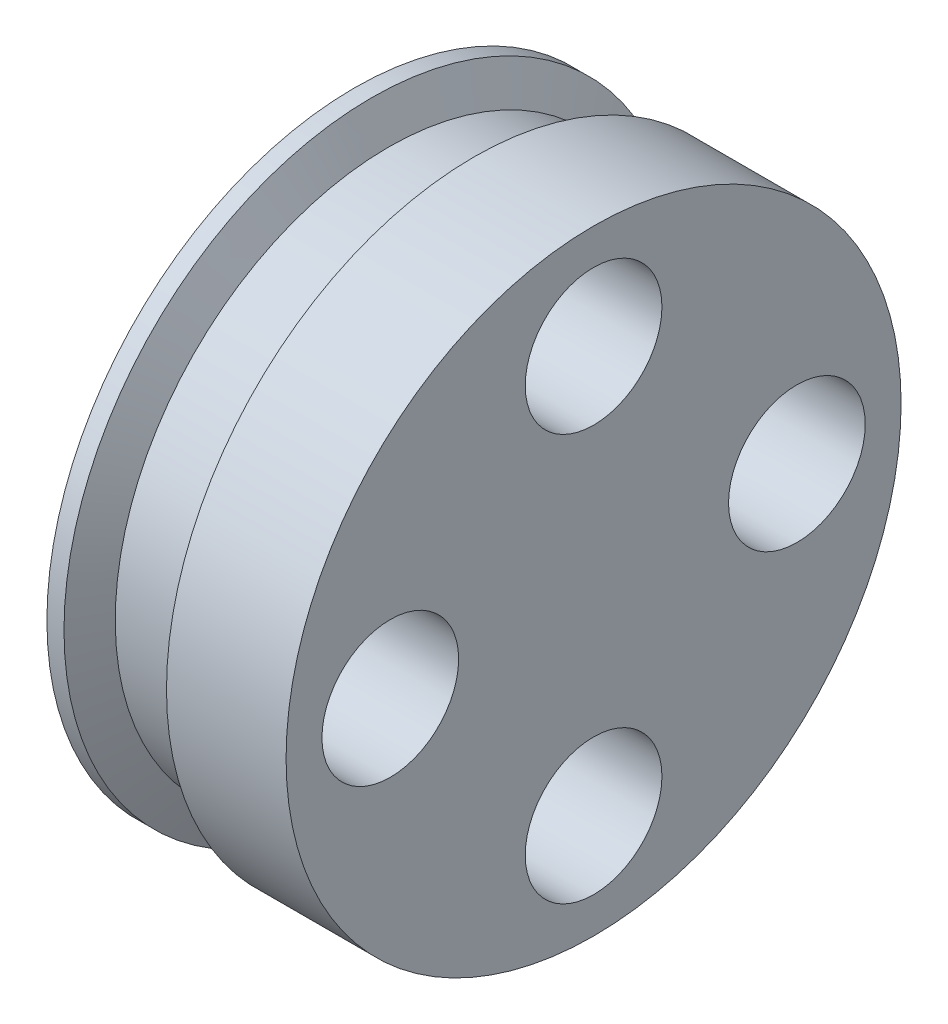
ISO-10303-21;
HEADER;
FILE_DESCRIPTION(('STEP AP214'),'2;1');
FILE_NAME('part.step','',(''),(''),'','','');
FILE_SCHEMA(('AUTOMOTIVE_DESIGN { 1 0 10303 214 1 1 1 1 }'));
ENDSEC;
DATA;
#1=APPLICATION_CONTEXT('core data for automotive mechanical design processes');
#2=APPLICATION_PROTOCOL_DEFINITION('international standard','automotive_design',2000,#1);
#3=PRODUCT_CONTEXT('',#1,'mechanical');
#4=PRODUCT('Part','Part','',(#3));
#5=PRODUCT_RELATED_PRODUCT_CATEGORY('part','',(#4));
#6=PRODUCT_DEFINITION_FORMATION('','',#4);
#7=PRODUCT_DEFINITION_CONTEXT('part definition',#1,'design');
#8=PRODUCT_DEFINITION('design','',#6,#7);
#9=PRODUCT_DEFINITION_SHAPE('','',#8);
#10=(LENGTH_UNIT() NAMED_UNIT(*) SI_UNIT(.MILLI.,.METRE.));
#11=(NAMED_UNIT(*) PLANE_ANGLE_UNIT() SI_UNIT($,.RADIAN.));
#12=(NAMED_UNIT(*) SI_UNIT($,.STERADIAN.) SOLID_ANGLE_UNIT());
#13=UNCERTAINTY_MEASURE_WITH_UNIT(LENGTH_MEASURE(1.E-05),#10,'distance_accuracy_value','');
#14=(GEOMETRIC_REPRESENTATION_CONTEXT(3) GLOBAL_UNCERTAINTY_ASSIGNED_CONTEXT((#13)) GLOBAL_UNIT_ASSIGNED_CONTEXT((#10,
#11,#12)) REPRESENTATION_CONTEXT('',''));
#15=CARTESIAN_POINT('',(0.,0.,0.));
#16=DIRECTION('',(0.,0.,1.));
#17=DIRECTION('',(1.,0.,0.));
#18=AXIS2_PLACEMENT_3D('',#15,#16,#17);
#19=CARTESIAN_POINT('',(0.,0.,0.));
#20=DIRECTION('',(-1.,0.,0.));
#21=DIRECTION('',(0.,-1.,0.));
#22=AXIS2_PLACEMENT_3D('',#19,#20,#21);
#23=PLANE('',#22);
#24=CARTESIAN_POINT('',(0.,5.95,0.));
#25=DIRECTION('',(-1.,0.,0.));
#26=DIRECTION('',(0.,-1.,0.));
#27=AXIS2_PLACEMENT_3D('',#24,#25,#26);
#28=CIRCLE('',#27,2.);
#29=CARTESIAN_POINT('',(0.,3.95,0.));
#30=VERTEX_POINT('',#29);
#31=EDGE_CURVE('E51',#30,#30,#28,.T.);
#32=ORIENTED_EDGE('',*,*,#31,.F.);
#33=EDGE_LOOP('',(#32));
#34=FACE_BOUND('',#33,.T.);
#35=CARTESIAN_POINT('',(0.,0.,5.95000000000008));
#36=DIRECTION('',(-1.,0.,0.));
#37=DIRECTION('',(0.,-1.,0.));
#38=AXIS2_PLACEMENT_3D('',#35,#36,#37);
#39=CIRCLE('',#38,2.);
#40=CARTESIAN_POINT('',(0.,-1.99999999999992,5.95000000000008));
#41=VERTEX_POINT('',#40);
#42=EDGE_CURVE('E101',#41,#41,#39,.T.);
#43=ORIENTED_EDGE('',*,*,#42,.F.);
#44=EDGE_LOOP('',(#43));
#45=FACE_BOUND('',#44,.T.);
#46=CARTESIAN_POINT('',(0.,-5.95,1.57832831033188E-13));
#47=DIRECTION('',(-1.,0.,0.));
#48=DIRECTION('',(0.,-1.,0.));
#49=AXIS2_PLACEMENT_3D('',#46,#47,#48);
#50=CIRCLE('',#49,2.);
#51=CARTESIAN_POINT('',(0.,-7.95,1.57832831033188E-13));
#52=VERTEX_POINT('',#51);
#53=EDGE_CURVE('E105',#52,#52,#50,.T.);
#54=ORIENTED_EDGE('',*,*,#53,.F.);
#55=EDGE_LOOP('',(#54));
#56=FACE_BOUND('',#55,.T.);
#57=CARTESIAN_POINT('',(0.,0.,-5.94999999999992));
#58=DIRECTION('',(-1.,0.,0.));
#59=DIRECTION('',(0.,-1.,0.));
#60=AXIS2_PLACEMENT_3D('',#57,#58,#59);
#61=CIRCLE('',#60,2.);
#62=CARTESIAN_POINT('',(0.,-2.00000000000008,-5.94999999999992));
#63=VERTEX_POINT('',#62);
#64=EDGE_CURVE('E70',#63,#63,#61,.T.);
#65=ORIENTED_EDGE('',*,*,#64,.F.);
#66=EDGE_LOOP('',(#65));
#67=FACE_BOUND('',#66,.T.);
#68=CARTESIAN_POINT('',(0.,0.,0.));
#69=DIRECTION('',(1.,0.,0.));
#70=DIRECTION('',(0.,1.,0.));
#71=AXIS2_PLACEMENT_3D('',#68,#69,#70);
#72=CIRCLE('',#71,9.);
#73=CARTESIAN_POINT('',(0.,9.,0.));
#74=VERTEX_POINT('',#73);
#75=EDGE_CURVE('E10',#74,#74,#72,.T.);
#76=ORIENTED_EDGE('',*,*,#75,.F.);
#77=EDGE_LOOP('',(#76));
#78=FACE_BOUND('',#77,.T.);
#79=ADVANCED_FACE('F31',(#34,#45,#56,#67,#78),#23,.T.);
#80=CARTESIAN_POINT('',(4.,0.,0.));
#81=DIRECTION('',(1.,0.,0.));
#82=DIRECTION('',(0.,1.,0.));
#83=AXIS2_PLACEMENT_3D('',#80,#81,#82);
#84=CYLINDRICAL_SURFACE('',#83,9.);
#85=ORIENTED_EDGE('',*,*,#75,.T.);
#86=EDGE_LOOP('',(#85));
#87=FACE_BOUND('',#86,.T.);
#88=CARTESIAN_POINT('',(0.5,0.,0.));
#89=DIRECTION('',(1.,0.,0.));
#90=DIRECTION('',(0.,1.,0.));
#91=AXIS2_PLACEMENT_3D('',#88,#89,#90);
#92=CIRCLE('',#91,9.);
#93=CARTESIAN_POINT('',(0.5,9.,0.));
#94=VERTEX_POINT('',#93);
#95=EDGE_CURVE('E38',#94,#94,#92,.T.);
#96=ORIENTED_EDGE('',*,*,#95,.F.);
#97=EDGE_LOOP('',(#96));
#98=FACE_BOUND('',#97,.T.);
#99=ADVANCED_FACE('F82',(#87,#98),#84,.T.);
#100=CARTESIAN_POINT('',(1.,0.,0.));
#101=DIRECTION('',(-1.,0.,0.));
#102=DIRECTION('',(0.,-1.,0.));
#103=AXIS2_PLACEMENT_3D('',#100,#101,#102);
#104=CONICAL_SURFACE('',#103,8.,1.10714871779409);
#105=ORIENTED_EDGE('',*,*,#95,.T.);
#106=EDGE_LOOP('',(#105));
#107=FACE_BOUND('',#106,.T.);
#108=CARTESIAN_POINT('',(1.,0.,0.));
#109=DIRECTION('',(1.,0.,0.));
#110=DIRECTION('',(0.,1.,0.));
#111=AXIS2_PLACEMENT_3D('',#108,#109,#110);
#112=CIRCLE('',#111,8.);
#113=CARTESIAN_POINT('',(1.,8.,0.));
#114=VERTEX_POINT('',#113);
#115=EDGE_CURVE('E43',#114,#114,#112,.T.);
#116=ORIENTED_EDGE('',*,*,#115,.F.);
#117=EDGE_LOOP('',(#116));
#118=FACE_BOUND('',#117,.T.);
#119=ADVANCED_FACE('F80',(#107,#118),#104,.T.);
#120=CARTESIAN_POINT('',(4.,0.,0.));
#121=DIRECTION('',(1.,0.,0.));
#122=DIRECTION('',(0.,1.,0.));
#123=AXIS2_PLACEMENT_3D('',#120,#121,#122);
#124=CYLINDRICAL_SURFACE('',#123,8.);
#125=ORIENTED_EDGE('',*,*,#115,.T.);
#126=EDGE_LOOP('',(#125));
#127=FACE_BOUND('',#126,.T.);
#128=CARTESIAN_POINT('',(3.,0.,0.));
#129=DIRECTION('',(1.,0.,0.));
#130=DIRECTION('',(0.,1.,0.));
#131=AXIS2_PLACEMENT_3D('',#128,#129,#130);
#132=CIRCLE('',#131,8.);
#133=CARTESIAN_POINT('',(3.,8.,0.));
#134=VERTEX_POINT('',#133);
#135=EDGE_CURVE('E67',#134,#134,#132,.T.);
#136=ORIENTED_EDGE('',*,*,#135,.F.);
#137=EDGE_LOOP('',(#136));
#138=FACE_BOUND('',#137,.T.);
#139=ADVANCED_FACE('F77',(#127,#138),#124,.T.);
#140=CARTESIAN_POINT('',(3.5,0.,0.));
#141=DIRECTION('',(1.,0.,0.));
#142=DIRECTION('',(0.,1.,0.));
#143=AXIS2_PLACEMENT_3D('',#140,#141,#142);
#144=CONICAL_SURFACE('',#143,9.,1.10714871779409);
#145=ORIENTED_EDGE('',*,*,#135,.T.);
#146=EDGE_LOOP('',(#145));
#147=FACE_BOUND('',#146,.T.);
#148=CARTESIAN_POINT('',(3.5,0.,0.));
#149=DIRECTION('',(1.,0.,0.));
#150=DIRECTION('',(0.,1.,0.));
#151=AXIS2_PLACEMENT_3D('',#148,#149,#150);
#152=CIRCLE('',#151,9.);
#153=CARTESIAN_POINT('',(3.5,9.,0.));
#154=VERTEX_POINT('',#153);
#155=EDGE_CURVE('E62',#154,#154,#152,.T.);
#156=ORIENTED_EDGE('',*,*,#155,.F.);
#157=EDGE_LOOP('',(#156));
#158=FACE_BOUND('',#157,.T.);
#159=ADVANCED_FACE('F89',(#147,#158),#144,.T.);
#160=CARTESIAN_POINT('',(4.,0.,0.));
#161=DIRECTION('',(1.,0.,0.));
#162=DIRECTION('',(0.,1.,0.));
#163=AXIS2_PLACEMENT_3D('',#160,#161,#162);
#164=CYLINDRICAL_SURFACE('',#163,9.);
#165=ORIENTED_EDGE('',*,*,#155,.T.);
#166=EDGE_LOOP('',(#165));
#167=FACE_BOUND('',#166,.T.);
#168=CARTESIAN_POINT('',(7.,0.,0.));
#169=DIRECTION('',(1.,0.,0.));
#170=DIRECTION('',(0.,1.,0.));
#171=AXIS2_PLACEMENT_3D('',#168,#169,#170);
#172=CIRCLE('',#171,9.);
#173=CARTESIAN_POINT('',(7.,9.,0.));
#174=VERTEX_POINT('',#173);
#175=EDGE_CURVE('E58',#174,#174,#172,.T.);
#176=ORIENTED_EDGE('',*,*,#175,.F.);
#177=EDGE_LOOP('',(#176));
#178=FACE_BOUND('',#177,.T.);
#179=ADVANCED_FACE('F134',(#167,#178),#164,.T.);
#180=CARTESIAN_POINT('',(7.,0.,0.));
#181=DIRECTION('',(1.,0.,0.));
#182=DIRECTION('',(0.,1.,0.));
#183=AXIS2_PLACEMENT_3D('',#180,#181,#182);
#184=PLANE('',#183);
#185=CARTESIAN_POINT('',(7.,5.95,0.));
#186=DIRECTION('',(1.,0.,0.));
#187=DIRECTION('',(0.,1.,0.));
#188=AXIS2_PLACEMENT_3D('',#185,#186,#187);
#189=CIRCLE('',#188,2.);
#190=CARTESIAN_POINT('',(7.,7.95,0.));
#191=VERTEX_POINT('',#190);
#192=EDGE_CURVE('E34',#191,#191,#189,.T.);
#193=ORIENTED_EDGE('',*,*,#192,.F.);
#194=EDGE_LOOP('',(#193));
#195=FACE_BOUND('',#194,.T.);
#196=CARTESIAN_POINT('',(7.,0.,5.95000000000008));
#197=DIRECTION('',(1.,0.,0.));
#198=DIRECTION('',(0.,1.,0.));
#199=AXIS2_PLACEMENT_3D('',#196,#197,#198);
#200=CIRCLE('',#199,2.);
#201=CARTESIAN_POINT('',(7.,2.00000000000008,5.95000000000008));
#202=VERTEX_POINT('',#201);
#203=EDGE_CURVE('E53',#202,#202,#200,.T.);
#204=ORIENTED_EDGE('',*,*,#203,.F.);
#205=EDGE_LOOP('',(#204));
#206=FACE_BOUND('',#205,.T.);
#207=CARTESIAN_POINT('',(7.,-5.95,1.57832831033188E-13));
#208=DIRECTION('',(1.,0.,0.));
#209=DIRECTION('',(0.,1.,0.));
#210=AXIS2_PLACEMENT_3D('',#207,#208,#209);
#211=CIRCLE('',#210,2.);
#212=CARTESIAN_POINT('',(7.,-3.95,1.57832831033188E-13));
#213=VERTEX_POINT('',#212);
#214=EDGE_CURVE('E50',#213,#213,#211,.T.);
#215=ORIENTED_EDGE('',*,*,#214,.F.);
#216=EDGE_LOOP('',(#215));
#217=FACE_BOUND('',#216,.T.);
#218=CARTESIAN_POINT('',(7.,0.,-5.94999999999992));
#219=DIRECTION('',(1.,0.,0.));
#220=DIRECTION('',(0.,1.,0.));
#221=AXIS2_PLACEMENT_3D('',#218,#219,#220);
#222=CIRCLE('',#221,2.);
#223=CARTESIAN_POINT('',(7.,1.99999999999992,-5.94999999999992));
#224=VERTEX_POINT('',#223);
#225=EDGE_CURVE('E47',#224,#224,#222,.T.);
#226=ORIENTED_EDGE('',*,*,#225,.F.);
#227=EDGE_LOOP('',(#226));
#228=FACE_BOUND('',#227,.T.);
#229=ORIENTED_EDGE('',*,*,#175,.T.);
#230=EDGE_LOOP('',(#229));
#231=FACE_BOUND('',#230,.T.);
#232=ADVANCED_FACE('F130',(#195,#206,#217,#228,#231),#184,.T.);
#233=CARTESIAN_POINT('',(10.,0.,-5.94999999999992));
#234=DIRECTION('',(-1.,0.,0.));
#235=DIRECTION('',(0.,-1.,0.));
#236=AXIS2_PLACEMENT_3D('',#233,#234,#235);
#237=CYLINDRICAL_SURFACE('',#236,2.);
#238=ORIENTED_EDGE('',*,*,#225,.T.);
#239=EDGE_LOOP('',(#238));
#240=FACE_BOUND('',#239,.T.);
#241=ORIENTED_EDGE('',*,*,#64,.T.);
#242=EDGE_LOOP('',(#241));
#243=FACE_BOUND('',#242,.T.);
#244=ADVANCED_FACE('F126',(#240,#243),#237,.F.);
#245=CARTESIAN_POINT('',(10.,-5.95,1.57832831033188E-13));
#246=DIRECTION('',(-1.,0.,0.));
#247=DIRECTION('',(0.,-1.,0.));
#248=AXIS2_PLACEMENT_3D('',#245,#246,#247);
#249=CYLINDRICAL_SURFACE('',#248,2.);
#250=ORIENTED_EDGE('',*,*,#214,.T.);
#251=EDGE_LOOP('',(#250));
#252=FACE_BOUND('',#251,.T.);
#253=ORIENTED_EDGE('',*,*,#53,.T.);
#254=EDGE_LOOP('',(#253));
#255=FACE_BOUND('',#254,.T.);
#256=ADVANCED_FACE('F121',(#252,#255),#249,.F.);
#257=CARTESIAN_POINT('',(10.,0.,5.95000000000008));
#258=DIRECTION('',(-1.,0.,0.));
#259=DIRECTION('',(0.,-1.,0.));
#260=AXIS2_PLACEMENT_3D('',#257,#258,#259);
#261=CYLINDRICAL_SURFACE('',#260,2.);
#262=ORIENTED_EDGE('',*,*,#203,.T.);
#263=EDGE_LOOP('',(#262));
#264=FACE_BOUND('',#263,.T.);
#265=ORIENTED_EDGE('',*,*,#42,.T.);
#266=EDGE_LOOP('',(#265));
#267=FACE_BOUND('',#266,.T.);
#268=ADVANCED_FACE('F116',(#264,#267),#261,.F.);
#269=CARTESIAN_POINT('',(10.,5.95,0.));
#270=DIRECTION('',(-1.,0.,0.));
#271=DIRECTION('',(0.,-1.,0.));
#272=AXIS2_PLACEMENT_3D('',#269,#270,#271);
#273=CYLINDRICAL_SURFACE('',#272,2.);
#274=ORIENTED_EDGE('',*,*,#192,.T.);
#275=EDGE_LOOP('',(#274));
#276=FACE_BOUND('',#275,.T.);
#277=ORIENTED_EDGE('',*,*,#31,.T.);
#278=EDGE_LOOP('',(#277));
#279=FACE_BOUND('',#278,.T.);
#280=ADVANCED_FACE('F114',(#276,#279),#273,.F.);
#281=CLOSED_SHELL('',(#79,#99,#119,#139,#159,#179,#232,#244,#256,#268,#280));
#282=MANIFOLD_SOLID_BREP('B2',#281);
#283=ADVANCED_BREP_SHAPE_REPRESENTATION('',(#18,#282),#14);
#284=SHAPE_DEFINITION_REPRESENTATION(#9,#283);
ENDSEC;
END-ISO-10303-21;
